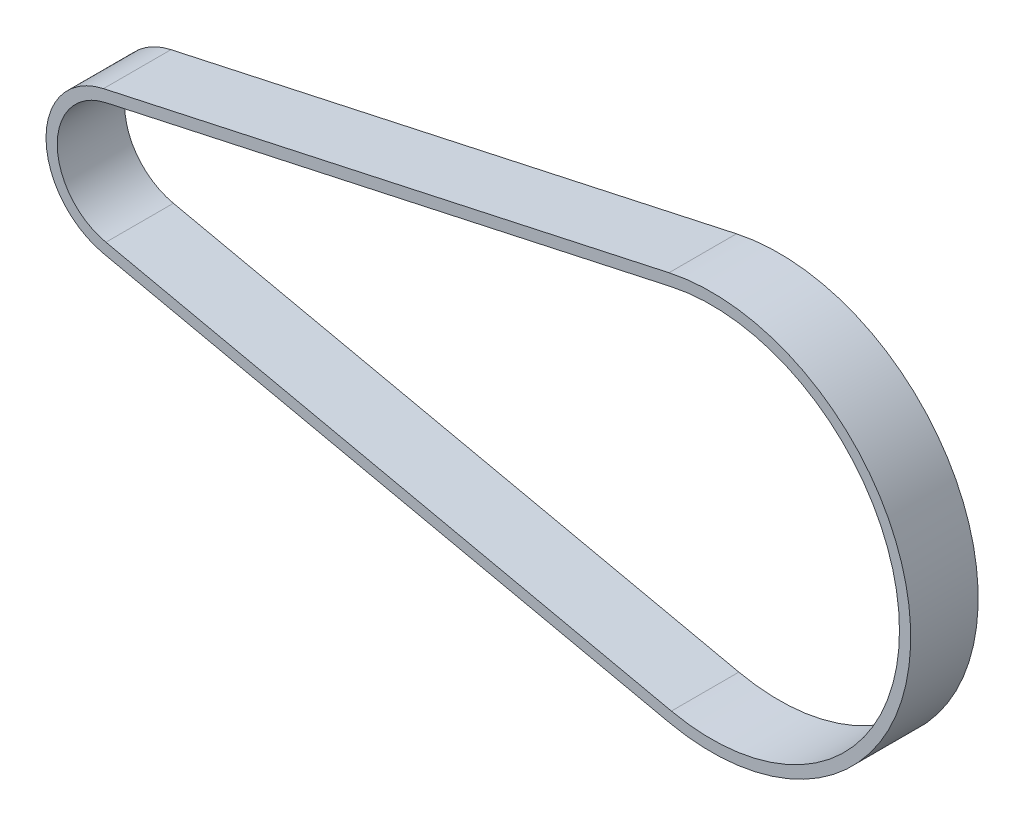
ISO-10303-21;
HEADER;
FILE_DESCRIPTION(('STEP AP214'),'2;1');
FILE_NAME('part.step','',(''),(''),'','','');
FILE_SCHEMA(('AUTOMOTIVE_DESIGN { 1 0 10303 214 1 1 1 1 }'));
ENDSEC;
DATA;
#1=APPLICATION_CONTEXT('core data for automotive mechanical design processes');
#2=APPLICATION_PROTOCOL_DEFINITION('international standard','automotive_design',2000,#1);
#3=PRODUCT_CONTEXT('',#1,'mechanical');
#4=PRODUCT('Part','Part','',(#3));
#5=PRODUCT_RELATED_PRODUCT_CATEGORY('part','',(#4));
#6=PRODUCT_DEFINITION_FORMATION('','',#4);
#7=PRODUCT_DEFINITION_CONTEXT('part definition',#1,'design');
#8=PRODUCT_DEFINITION('design','',#6,#7);
#9=PRODUCT_DEFINITION_SHAPE('','',#8);
#10=(LENGTH_UNIT() NAMED_UNIT(*) SI_UNIT(.MILLI.,.METRE.));
#11=(NAMED_UNIT(*) PLANE_ANGLE_UNIT() SI_UNIT($,.RADIAN.));
#12=(NAMED_UNIT(*) SI_UNIT($,.STERADIAN.) SOLID_ANGLE_UNIT());
#13=UNCERTAINTY_MEASURE_WITH_UNIT(LENGTH_MEASURE(1.E-05),#10,'distance_accuracy_value','');
#14=(GEOMETRIC_REPRESENTATION_CONTEXT(3) GLOBAL_UNCERTAINTY_ASSIGNED_CONTEXT((#13)) GLOBAL_UNIT_ASSIGNED_CONTEXT((#10,
#11,#12)) REPRESENTATION_CONTEXT('',''));
#15=CARTESIAN_POINT('',(0.,0.,0.));
#16=DIRECTION('',(0.,0.,1.));
#17=DIRECTION('',(1.,0.,0.));
#18=AXIS2_PLACEMENT_3D('',#15,#16,#17);
#19=CARTESIAN_POINT('',(0.,0.,6.));
#20=DIRECTION('',(0.,0.,1.));
#21=DIRECTION('',(1.,0.,0.));
#22=AXIS2_PLACEMENT_3D('',#19,#20,#21);
#23=PLANE('',#22);
#24=CARTESIAN_POINT('',(0.,0.,6.));
#25=DIRECTION('',(0.,0.,1.));
#26=DIRECTION('',(1.,0.,0.));
#27=AXIS2_PLACEMENT_3D('',#24,#25,#26);
#28=CIRCLE('',#27,6.5);
#29=CARTESIAN_POINT('',(-1.38452776459421,6.35083324210829,6.));
#30=VERTEX_POINT('',#29);
#31=CARTESIAN_POINT('',(-1.38452776459421,-6.35083324210829,6.));
#32=VERTEX_POINT('',#31);
#33=EDGE_CURVE('E138',#30,#32,#28,.T.);
#34=ORIENTED_EDGE('',*,*,#33,.T.);
#35=DIRECTION('',(0.977051268016661,-0.213004271476032,0.));
#36=VECTOR('',#35,1.);
#37=CARTESIAN_POINT('',(-1.38452776459421,-6.35083324210829,6.));
#38=LINE('',#37,#36);
#39=CARTESIAN_POINT('',(48.9005643094447,-17.3133484692552,6.));
#40=VERTEX_POINT('',#39);
#41=EDGE_CURVE('E141',#32,#40,#38,.T.);
#42=ORIENTED_EDGE('',*,*,#41,.T.);
#43=CARTESIAN_POINT('',(52.675,0.,6.));
#44=DIRECTION('',(0.,0.,1.));
#45=DIRECTION('',(1.,0.,0.));
#46=AXIS2_PLACEMENT_3D('',#43,#44,#45);
#47=CIRCLE('',#46,17.72);
#48=CARTESIAN_POINT('',(48.9005643094447,17.3133484692552,6.));
#49=VERTEX_POINT('',#48);
#50=EDGE_CURVE('E144',#40,#49,#47,.T.);
#51=ORIENTED_EDGE('',*,*,#50,.T.);
#52=DIRECTION('',(-0.977051268016661,-0.213004271476032,0.));
#53=VECTOR('',#52,1.);
#54=CARTESIAN_POINT('',(-1.38452776459421,6.35083324210829,6.));
#55=LINE('',#54,#53);
#56=EDGE_CURVE('E146',#49,#30,#55,.T.);
#57=ORIENTED_EDGE('',*,*,#56,.T.);
#58=EDGE_LOOP('',(#34,#42,#51,#57));
#59=FACE_BOUND('',#58,.T.);
#60=DIRECTION('',(0.977051268016661,-0.213004271476032,0.));
#61=VECTOR('',#60,1.);
#62=CARTESIAN_POINT('',(-1.17152349311818,-5.37378197409163,6.));
#63=LINE('',#62,#61);
#64=CARTESIAN_POINT('',(-1.17152349311818,-5.37378197409163,6.));
#65=VERTEX_POINT('',#64);
#66=CARTESIAN_POINT('',(49.1135685809207,-16.3362972012386,6.));
#67=VERTEX_POINT('',#66);
#68=EDGE_CURVE('E110',#65,#67,#63,.T.);
#69=ORIENTED_EDGE('',*,*,#68,.F.);
#70=CARTESIAN_POINT('',(0.,0.,6.));
#71=DIRECTION('',(0.,0.,1.));
#72=DIRECTION('',(1.,0.,0.));
#73=AXIS2_PLACEMENT_3D('',#70,#71,#72);
#74=CIRCLE('',#73,5.5);
#75=CARTESIAN_POINT('',(-1.17152349311818,5.37378197409163,6.));
#76=VERTEX_POINT('',#75);
#77=EDGE_CURVE('E102',#76,#65,#74,.T.);
#78=ORIENTED_EDGE('',*,*,#77,.F.);
#79=DIRECTION('',(-0.977051268016661,-0.213004271476032,0.));
#80=VECTOR('',#79,1.);
#81=CARTESIAN_POINT('',(-1.17152349311818,5.37378197409163,6.));
#82=LINE('',#81,#80);
#83=CARTESIAN_POINT('',(49.1135685809207,16.3362972012386,6.));
#84=VERTEX_POINT('',#83);
#85=EDGE_CURVE('E124',#84,#76,#82,.T.);
#86=ORIENTED_EDGE('',*,*,#85,.F.);
#87=CARTESIAN_POINT('',(52.675,0.,6.));
#88=DIRECTION('',(0.,0.,1.));
#89=DIRECTION('',(1.,0.,0.));
#90=AXIS2_PLACEMENT_3D('',#87,#88,#89);
#91=CIRCLE('',#90,16.72);
#92=EDGE_CURVE('E122',#67,#84,#91,.T.);
#93=ORIENTED_EDGE('',*,*,#92,.F.);
#94=EDGE_LOOP('',(#69,#78,#86,#93));
#95=FACE_BOUND('',#94,.T.);
#96=ADVANCED_FACE('F37',(#59,#95),#23,.T.);
#97=CARTESIAN_POINT('',(0.,0.,0.));
#98=DIRECTION('',(0.,0.,1.));
#99=DIRECTION('',(1.,0.,0.));
#100=AXIS2_PLACEMENT_3D('',#97,#98,#99);
#101=PLANE('',#100);
#102=CARTESIAN_POINT('',(0.,0.,0.));
#103=DIRECTION('',(0.,0.,1.));
#104=DIRECTION('',(1.,0.,0.));
#105=AXIS2_PLACEMENT_3D('',#102,#103,#104);
#106=CIRCLE('',#105,6.5);
#107=CARTESIAN_POINT('',(-1.38452776459421,6.35083324210829,0.));
#108=VERTEX_POINT('',#107);
#109=CARTESIAN_POINT('',(-1.38452776459421,-6.35083324210829,0.));
#110=VERTEX_POINT('',#109);
#111=EDGE_CURVE('E118',#108,#110,#106,.T.);
#112=ORIENTED_EDGE('',*,*,#111,.F.);
#113=DIRECTION('',(-0.977051268016661,-0.213004271476032,0.));
#114=VECTOR('',#113,1.);
#115=CARTESIAN_POINT('',(-1.38452776459421,6.35083324210829,0.));
#116=LINE('',#115,#114);
#117=CARTESIAN_POINT('',(48.9005643094447,17.3133484692552,0.));
#118=VERTEX_POINT('',#117);
#119=EDGE_CURVE('E142',#118,#108,#116,.T.);
#120=ORIENTED_EDGE('',*,*,#119,.F.);
#121=CARTESIAN_POINT('',(52.675,0.,0.));
#122=DIRECTION('',(0.,0.,1.));
#123=DIRECTION('',(1.,0.,0.));
#124=AXIS2_PLACEMENT_3D('',#121,#122,#123);
#125=CIRCLE('',#124,17.72);
#126=CARTESIAN_POINT('',(48.9005643094447,-17.3133484692552,0.));
#127=VERTEX_POINT('',#126);
#128=EDGE_CURVE('E153',#127,#118,#125,.T.);
#129=ORIENTED_EDGE('',*,*,#128,.F.);
#130=DIRECTION('',(0.977051268016661,-0.213004271476032,0.));
#131=VECTOR('',#130,1.);
#132=CARTESIAN_POINT('',(-1.38452776459421,-6.35083324210829,0.));
#133=LINE('',#132,#131);
#134=EDGE_CURVE('E151',#110,#127,#133,.T.);
#135=ORIENTED_EDGE('',*,*,#134,.F.);
#136=EDGE_LOOP('',(#112,#120,#129,#135));
#137=FACE_BOUND('',#136,.T.);
#138=CARTESIAN_POINT('',(0.,0.,0.));
#139=DIRECTION('',(0.,0.,1.));
#140=DIRECTION('',(1.,0.,0.));
#141=AXIS2_PLACEMENT_3D('',#138,#139,#140);
#142=CIRCLE('',#141,5.5);
#143=CARTESIAN_POINT('',(-1.17152349311818,5.37378197409163,0.));
#144=VERTEX_POINT('',#143);
#145=CARTESIAN_POINT('',(-1.17152349311818,-5.37378197409163,0.));
#146=VERTEX_POINT('',#145);
#147=EDGE_CURVE('E60',#144,#146,#142,.T.);
#148=ORIENTED_EDGE('',*,*,#147,.T.);
#149=DIRECTION('',(0.977051268016661,-0.213004271476032,0.));
#150=VECTOR('',#149,1.);
#151=CARTESIAN_POINT('',(-1.17152349311818,-5.37378197409163,0.));
#152=LINE('',#151,#150);
#153=CARTESIAN_POINT('',(49.1135685809207,-16.3362972012386,0.));
#154=VERTEX_POINT('',#153);
#155=EDGE_CURVE('E117',#146,#154,#152,.T.);
#156=ORIENTED_EDGE('',*,*,#155,.T.);
#157=CARTESIAN_POINT('',(52.675,0.,0.));
#158=DIRECTION('',(0.,0.,1.));
#159=DIRECTION('',(1.,0.,0.));
#160=AXIS2_PLACEMENT_3D('',#157,#158,#159);
#161=CIRCLE('',#160,16.72);
#162=CARTESIAN_POINT('',(49.1135685809207,16.3362972012386,0.));
#163=VERTEX_POINT('',#162);
#164=EDGE_CURVE('E130',#154,#163,#161,.T.);
#165=ORIENTED_EDGE('',*,*,#164,.T.);
#166=DIRECTION('',(-0.977051268016661,-0.213004271476032,0.));
#167=VECTOR('',#166,1.);
#168=CARTESIAN_POINT('',(-1.17152349311818,5.37378197409163,0.));
#169=LINE('',#168,#167);
#170=EDGE_CURVE('E111',#163,#144,#169,.T.);
#171=ORIENTED_EDGE('',*,*,#170,.T.);
#172=EDGE_LOOP('',(#148,#156,#165,#171));
#173=FACE_BOUND('',#172,.T.);
#174=ADVANCED_FACE('F171',(#137,#173),#101,.F.);
#175=CARTESIAN_POINT('',(0.,0.,6.));
#176=DIRECTION('',(0.,0.,-1.));
#177=DIRECTION('',(-1.,0.,0.));
#178=AXIS2_PLACEMENT_3D('',#175,#176,#177);
#179=CYLINDRICAL_SURFACE('',#178,6.5);
#180=ORIENTED_EDGE('',*,*,#111,.T.);
#181=DIRECTION('',(0.,0.,-1.));
#182=VECTOR('',#181,1.);
#183=CARTESIAN_POINT('',(-1.38452776459421,-6.35083324210829,6.));
#184=LINE('',#183,#182);
#185=EDGE_CURVE('E11',#32,#110,#184,.T.);
#186=ORIENTED_EDGE('',*,*,#185,.F.);
#187=ORIENTED_EDGE('',*,*,#33,.F.);
#188=DIRECTION('',(0.,0.,-1.));
#189=VECTOR('',#188,1.);
#190=CARTESIAN_POINT('',(-1.38452776459421,6.35083324210829,6.));
#191=LINE('',#190,#189);
#192=EDGE_CURVE('E148',#30,#108,#191,.T.);
#193=ORIENTED_EDGE('',*,*,#192,.T.);
#194=EDGE_LOOP('',(#180,#186,#187,#193));
#195=FACE_BOUND('',#194,.T.);
#196=ADVANCED_FACE('F39',(#195),#179,.T.);
#197=CARTESIAN_POINT('',(-1.38452776459421,-6.35083324210829,6.));
#198=DIRECTION('',(0.213004271476032,0.977051268016661,0.));
#199=DIRECTION('',(-0.977051268016661,0.213004271476032,0.));
#200=AXIS2_PLACEMENT_3D('',#197,#198,#199);
#201=PLANE('',#200);
#202=ORIENTED_EDGE('',*,*,#134,.T.);
#203=DIRECTION('',(0.,0.,-1.));
#204=VECTOR('',#203,1.);
#205=CARTESIAN_POINT('',(48.9005643094447,-17.3133484692552,6.));
#206=LINE('',#205,#204);
#207=EDGE_CURVE('E45',#40,#127,#206,.T.);
#208=ORIENTED_EDGE('',*,*,#207,.F.);
#209=ORIENTED_EDGE('',*,*,#41,.F.);
#210=ORIENTED_EDGE('',*,*,#185,.T.);
#211=EDGE_LOOP('',(#202,#208,#209,#210));
#212=FACE_BOUND('',#211,.T.);
#213=ADVANCED_FACE('F181',(#212),#201,.F.);
#214=CARTESIAN_POINT('',(52.675,0.,6.));
#215=DIRECTION('',(0.,0.,-1.));
#216=DIRECTION('',(-1.,0.,0.));
#217=AXIS2_PLACEMENT_3D('',#214,#215,#216);
#218=CYLINDRICAL_SURFACE('',#217,17.72);
#219=ORIENTED_EDGE('',*,*,#128,.T.);
#220=DIRECTION('',(0.,0.,-1.));
#221=VECTOR('',#220,1.);
#222=CARTESIAN_POINT('',(48.9005643094447,17.3133484692552,6.));
#223=LINE('',#222,#221);
#224=EDGE_CURVE('E158',#49,#118,#223,.T.);
#225=ORIENTED_EDGE('',*,*,#224,.F.);
#226=ORIENTED_EDGE('',*,*,#50,.F.);
#227=ORIENTED_EDGE('',*,*,#207,.T.);
#228=EDGE_LOOP('',(#219,#225,#226,#227));
#229=FACE_BOUND('',#228,.T.);
#230=ADVANCED_FACE('F165',(#229),#218,.T.);
#231=CARTESIAN_POINT('',(-1.38452776459421,6.35083324210829,6.));
#232=DIRECTION('',(0.213004271476032,-0.977051268016661,0.));
#233=DIRECTION('',(0.977051268016661,0.213004271476032,0.));
#234=AXIS2_PLACEMENT_3D('',#231,#232,#233);
#235=PLANE('',#234);
#236=ORIENTED_EDGE('',*,*,#119,.T.);
#237=ORIENTED_EDGE('',*,*,#192,.F.);
#238=ORIENTED_EDGE('',*,*,#56,.F.);
#239=ORIENTED_EDGE('',*,*,#224,.T.);
#240=EDGE_LOOP('',(#236,#237,#238,#239));
#241=FACE_BOUND('',#240,.T.);
#242=ADVANCED_FACE('F175',(#241),#235,.F.);
#243=CARTESIAN_POINT('',(0.,0.,6.));
#244=DIRECTION('',(0.,0.,-1.));
#245=DIRECTION('',(-1.,0.,0.));
#246=AXIS2_PLACEMENT_3D('',#243,#244,#245);
#247=CYLINDRICAL_SURFACE('',#246,5.5);
#248=ORIENTED_EDGE('',*,*,#147,.F.);
#249=DIRECTION('',(0.,0.,-1.));
#250=VECTOR('',#249,1.);
#251=CARTESIAN_POINT('',(-1.17152349311818,5.37378197409163,6.));
#252=LINE('',#251,#250);
#253=EDGE_CURVE('E106',#76,#144,#252,.T.);
#254=ORIENTED_EDGE('',*,*,#253,.F.);
#255=ORIENTED_EDGE('',*,*,#77,.T.);
#256=DIRECTION('',(0.,0.,-1.));
#257=VECTOR('',#256,1.);
#258=CARTESIAN_POINT('',(-1.17152349311818,-5.37378197409163,6.));
#259=LINE('',#258,#257);
#260=EDGE_CURVE('E105',#65,#146,#259,.T.);
#261=ORIENTED_EDGE('',*,*,#260,.T.);
#262=EDGE_LOOP('',(#248,#254,#255,#261));
#263=FACE_BOUND('',#262,.T.);
#264=ADVANCED_FACE('F104',(#263),#247,.F.);
#265=CARTESIAN_POINT('',(-1.17152349311818,-5.37378197409163,6.));
#266=DIRECTION('',(0.213004271476032,0.977051268016661,0.));
#267=DIRECTION('',(-0.977051268016661,0.213004271476032,0.));
#268=AXIS2_PLACEMENT_3D('',#265,#266,#267);
#269=PLANE('',#268);
#270=ORIENTED_EDGE('',*,*,#155,.F.);
#271=ORIENTED_EDGE('',*,*,#260,.F.);
#272=ORIENTED_EDGE('',*,*,#68,.T.);
#273=DIRECTION('',(0.,0.,-1.));
#274=VECTOR('',#273,1.);
#275=CARTESIAN_POINT('',(49.1135685809207,-16.3362972012386,6.));
#276=LINE('',#275,#274);
#277=EDGE_CURVE('E119',#67,#154,#276,.T.);
#278=ORIENTED_EDGE('',*,*,#277,.T.);
#279=EDGE_LOOP('',(#270,#271,#272,#278));
#280=FACE_BOUND('',#279,.T.);
#281=ADVANCED_FACE('F114',(#280),#269,.T.);
#282=CARTESIAN_POINT('',(52.675,0.,6.));
#283=DIRECTION('',(0.,0.,-1.));
#284=DIRECTION('',(-1.,0.,0.));
#285=AXIS2_PLACEMENT_3D('',#282,#283,#284);
#286=CYLINDRICAL_SURFACE('',#285,16.72);
#287=ORIENTED_EDGE('',*,*,#164,.F.);
#288=ORIENTED_EDGE('',*,*,#277,.F.);
#289=ORIENTED_EDGE('',*,*,#92,.T.);
#290=DIRECTION('',(0.,0.,-1.));
#291=VECTOR('',#290,1.);
#292=CARTESIAN_POINT('',(49.1135685809207,16.3362972012386,6.));
#293=LINE('',#292,#291);
#294=EDGE_CURVE('E52',#84,#163,#293,.T.);
#295=ORIENTED_EDGE('',*,*,#294,.T.);
#296=EDGE_LOOP('',(#287,#288,#289,#295));
#297=FACE_BOUND('',#296,.T.);
#298=ADVANCED_FACE('F204',(#297),#286,.F.);
#299=CARTESIAN_POINT('',(-1.17152349311818,5.37378197409163,6.));
#300=DIRECTION('',(0.213004271476032,-0.977051268016661,0.));
#301=DIRECTION('',(0.977051268016661,0.213004271476032,0.));
#302=AXIS2_PLACEMENT_3D('',#299,#300,#301);
#303=PLANE('',#302);
#304=ORIENTED_EDGE('',*,*,#170,.F.);
#305=ORIENTED_EDGE('',*,*,#294,.F.);
#306=ORIENTED_EDGE('',*,*,#85,.T.);
#307=ORIENTED_EDGE('',*,*,#253,.T.);
#308=EDGE_LOOP('',(#304,#305,#306,#307));
#309=FACE_BOUND('',#308,.T.);
#310=ADVANCED_FACE('F208',(#309),#303,.T.);
#311=CLOSED_SHELL('',(#96,#174,#196,#213,#230,#242,#264,#281,#298,#310));
#312=MANIFOLD_SOLID_BREP('B2',#311);
#313=ADVANCED_BREP_SHAPE_REPRESENTATION('',(#18,#312),#14);
#314=SHAPE_DEFINITION_REPRESENTATION(#9,#313);
ENDSEC;
END-ISO-10303-21;
